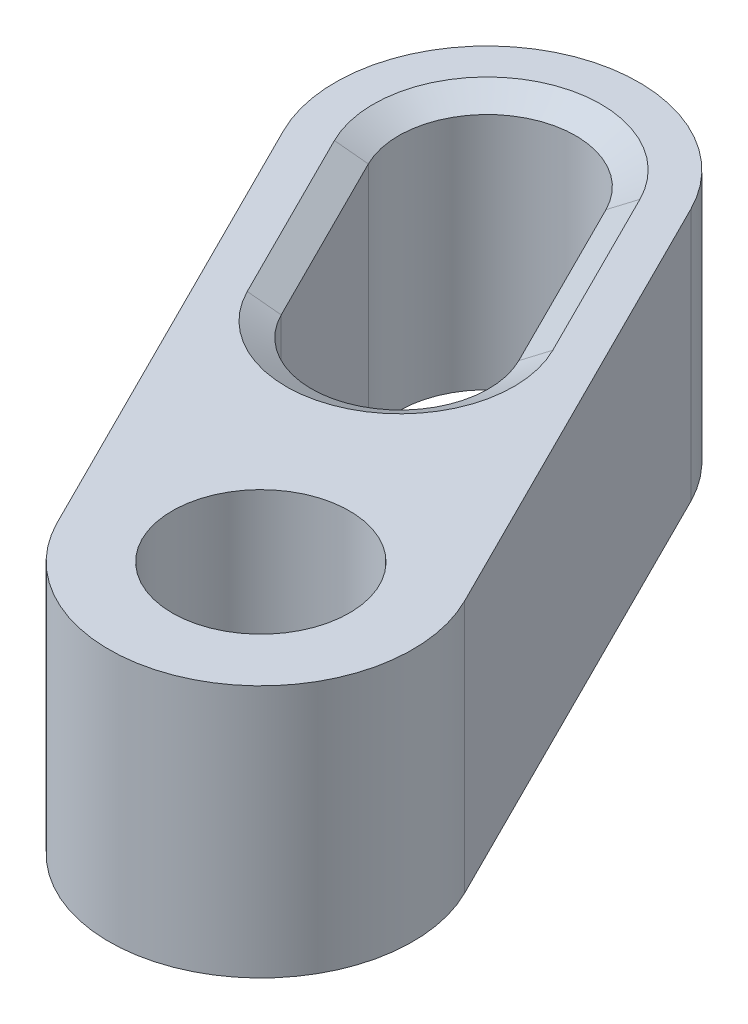
ISO-10303-21;
HEADER;
FILE_DESCRIPTION(('STEP AP214'),'2;1');
FILE_NAME('part.step','',(''),(''),'','','');
FILE_SCHEMA(('AUTOMOTIVE_DESIGN { 1 0 10303 214 1 1 1 1 }'));
ENDSEC;
DATA;
#1=APPLICATION_CONTEXT('core data for automotive mechanical design processes');
#2=APPLICATION_PROTOCOL_DEFINITION('international standard','automotive_design',2000,#1);
#3=PRODUCT_CONTEXT('',#1,'mechanical');
#4=PRODUCT('Part','Part','',(#3));
#5=PRODUCT_RELATED_PRODUCT_CATEGORY('part','',(#4));
#6=PRODUCT_DEFINITION_FORMATION('','',#4);
#7=PRODUCT_DEFINITION_CONTEXT('part definition',#1,'design');
#8=PRODUCT_DEFINITION('design','',#6,#7);
#9=PRODUCT_DEFINITION_SHAPE('','',#8);
#10=(LENGTH_UNIT() NAMED_UNIT(*) SI_UNIT(.MILLI.,.METRE.));
#11=(NAMED_UNIT(*) PLANE_ANGLE_UNIT() SI_UNIT($,.RADIAN.));
#12=(NAMED_UNIT(*) SI_UNIT($,.STERADIAN.) SOLID_ANGLE_UNIT());
#13=UNCERTAINTY_MEASURE_WITH_UNIT(LENGTH_MEASURE(1.E-05),#10,'distance_accuracy_value','');
#14=(GEOMETRIC_REPRESENTATION_CONTEXT(3) GLOBAL_UNCERTAINTY_ASSIGNED_CONTEXT((#13)) GLOBAL_UNIT_ASSIGNED_CONTEXT((#10,
#11,#12)) REPRESENTATION_CONTEXT('',''));
#15=CARTESIAN_POINT('',(0.,0.,0.));
#16=DIRECTION('',(0.,0.,1.));
#17=DIRECTION('',(1.,0.,0.));
#18=AXIS2_PLACEMENT_3D('',#15,#16,#17);
#19=CARTESIAN_POINT('',(12.75,5.,-34.2));
#20=DIRECTION('',(0.,1.,0.));
#21=DIRECTION('',(0.,0.,1.));
#22=AXIS2_PLACEMENT_3D('',#19,#20,#21);
#23=PLANE('',#22);
#24=DIRECTION('',(0.447213595499959,0.,0.894427190999916));
#25=VECTOR('',#24,1.);
#26=CARTESIAN_POINT('',(14.7624611797498,5.,-35.2062305898749));
#27=LINE('',#26,#25);
#28=CARTESIAN_POINT('',(10.2903252247502,5.,-44.1505024998741));
#29=VERTEX_POINT('',#28);
#30=CARTESIAN_POINT('',(12.0124611797498,5.,-40.7062305898749));
#31=VERTEX_POINT('',#30);
#32=EDGE_CURVE('E183',#29,#31,#27,.T.);
#33=ORIENTED_EDGE('',*,*,#32,.T.);
#34=CARTESIAN_POINT('',(10.,5.,-39.7));
#35=DIRECTION('',(0.,1.,0.));
#36=DIRECTION('',(0.,0.,1.));
#37=AXIS2_PLACEMENT_3D('',#34,#35,#36);
#38=CIRCLE('',#37,2.25000000000001);
#39=CARTESIAN_POINT('',(7.98753882025018,5.,-38.6937694101251));
#40=VERTEX_POINT('',#39);
#41=EDGE_CURVE('E185',#31,#40,#38,.F.);
#42=ORIENTED_EDGE('',*,*,#41,.T.);
#43=DIRECTION('',(-0.447213595499958,0.,-0.894427190999916));
#44=VECTOR('',#43,1.);
#45=CARTESIAN_POINT('',(10.7375388202502,5.,-33.1937694101251));
#46=LINE('',#45,#44);
#47=CARTESIAN_POINT('',(6.2654028652506,5.,-42.1380413201242));
#48=VERTEX_POINT('',#47);
#49=EDGE_CURVE('E181',#40,#48,#46,.T.);
#50=ORIENTED_EDGE('',*,*,#49,.T.);
#51=CARTESIAN_POINT('',(8.27786404500042,5.,-43.1442719099992));
#52=DIRECTION('',(0.,1.,0.));
#53=DIRECTION('',(0.,0.,1.));
#54=AXIS2_PLACEMENT_3D('',#51,#52,#53);
#55=CIRCLE('',#54,2.25000000000001);
#56=EDGE_CURVE('E179',#48,#29,#55,.F.);
#57=ORIENTED_EDGE('',*,*,#56,.T.);
#58=EDGE_LOOP('',(#33,#42,#50,#57));
#59=FACE_BOUND('',#58,.T.);
#60=CARTESIAN_POINT('',(12.75,5.,-34.2));
#61=DIRECTION('',(0.,1.,0.));
#62=DIRECTION('',(0.,0.,1.));
#63=AXIS2_PLACEMENT_3D('',#60,#61,#62);
#64=CIRCLE('',#63,3.);
#65=CARTESIAN_POINT('',(10.0667184270003,5.,-32.8583592135001));
#66=VERTEX_POINT('',#65);
#67=CARTESIAN_POINT('',(15.4332815729997,5.,-35.5416407864999));
#68=VERTEX_POINT('',#67);
#69=EDGE_CURVE('E149',#66,#68,#64,.T.);
#70=ORIENTED_EDGE('',*,*,#69,.T.);
#71=DIRECTION('',(-0.447213595499959,0.,-0.894427190999916));
#72=VECTOR('',#71,1.);
#73=CARTESIAN_POINT('',(15.4332815729997,5.,-35.5416407864999));
#74=LINE('',#73,#72);
#75=CARTESIAN_POINT('',(10.9611456180002,5.,-44.485912696499));
#76=VERTEX_POINT('',#75);
#77=EDGE_CURVE('E152',#68,#76,#74,.T.);
#78=ORIENTED_EDGE('',*,*,#77,.T.);
#79=CARTESIAN_POINT('',(8.27786404500042,5.,-43.1442719099992));
#80=DIRECTION('',(0.,1.,0.));
#81=DIRECTION('',(0.,0.,1.));
#82=AXIS2_PLACEMENT_3D('',#79,#80,#81);
#83=CIRCLE('',#82,3.);
#84=CARTESIAN_POINT('',(5.59458247200067,5.,-41.8026311234993));
#85=VERTEX_POINT('',#84);
#86=EDGE_CURVE('E155',#76,#85,#83,.T.);
#87=ORIENTED_EDGE('',*,*,#86,.T.);
#88=DIRECTION('',(0.447213595499959,0.,0.894427190999916));
#89=VECTOR('',#88,1.);
#90=CARTESIAN_POINT('',(10.0667184270003,5.,-32.8583592135001));
#91=LINE('',#90,#89);
#92=EDGE_CURVE('E157',#85,#66,#91,.T.);
#93=ORIENTED_EDGE('',*,*,#92,.T.);
#94=EDGE_LOOP('',(#70,#78,#87,#93));
#95=FACE_BOUND('',#94,.T.);
#96=CARTESIAN_POINT('',(12.75,5.,-34.2));
#97=DIRECTION('',(0.,1.,0.));
#98=DIRECTION('',(0.,0.,1.));
#99=AXIS2_PLACEMENT_3D('',#96,#97,#98);
#100=CIRCLE('',#99,1.75);
#101=CARTESIAN_POINT('',(12.75,5.,-32.45));
#102=VERTEX_POINT('',#101);
#103=EDGE_CURVE('E135',#102,#102,#100,.T.);
#104=ORIENTED_EDGE('',*,*,#103,.F.);
#105=EDGE_LOOP('',(#104));
#106=FACE_BOUND('',#105,.T.);
#107=ADVANCED_FACE('F33',(#59,#95,#106),#23,.T.);
#108=CARTESIAN_POINT('',(12.75,0.,-34.2));
#109=DIRECTION('',(0.,1.,0.));
#110=DIRECTION('',(0.,0.,1.));
#111=AXIS2_PLACEMENT_3D('',#108,#109,#110);
#112=PLANE('',#111);
#113=CARTESIAN_POINT('',(10.,0.,-39.7));
#114=DIRECTION('',(0.,1.,0.));
#115=DIRECTION('',(0.,0.,1.));
#116=AXIS2_PLACEMENT_3D('',#113,#114,#115);
#117=CIRCLE('',#116,1.75);
#118=CARTESIAN_POINT('',(8.43475241575014,0.,-38.9173762078751));
#119=VERTEX_POINT('',#118);
#120=CARTESIAN_POINT('',(11.5652475842499,0.,-40.4826237921249));
#121=VERTEX_POINT('',#120);
#122=EDGE_CURVE('E116',#119,#121,#117,.T.);
#123=ORIENTED_EDGE('',*,*,#122,.T.);
#124=DIRECTION('',(-0.447213595499959,0.,-0.894427190999916));
#125=VECTOR('',#124,1.);
#126=CARTESIAN_POINT('',(11.5652475842499,0.,-40.4826237921249));
#127=LINE('',#126,#125);
#128=CARTESIAN_POINT('',(9.84311162925027,0.,-43.9268957021241));
#129=VERTEX_POINT('',#128);
#130=EDGE_CURVE('E124',#121,#129,#127,.T.);
#131=ORIENTED_EDGE('',*,*,#130,.T.);
#132=CARTESIAN_POINT('',(8.27786404500042,0.,-43.1442719099992));
#133=DIRECTION('',(0.,1.,0.));
#134=DIRECTION('',(0.,0.,1.));
#135=AXIS2_PLACEMENT_3D('',#132,#133,#134);
#136=CIRCLE('',#135,1.75);
#137=CARTESIAN_POINT('',(6.71261646075056,0.,-42.3616481178742));
#138=VERTEX_POINT('',#137);
#139=EDGE_CURVE('E129',#129,#138,#136,.T.);
#140=ORIENTED_EDGE('',*,*,#139,.T.);
#141=DIRECTION('',(0.447213595499958,0.,0.894427190999916));
#142=VECTOR('',#141,1.);
#143=CARTESIAN_POINT('',(8.43475241575015,0.,-38.9173762078751));
#144=LINE('',#143,#142);
#145=EDGE_CURVE('E134',#138,#119,#144,.T.);
#146=ORIENTED_EDGE('',*,*,#145,.T.);
#147=EDGE_LOOP('',(#123,#131,#140,#146));
#148=FACE_BOUND('',#147,.T.);
#149=CARTESIAN_POINT('',(12.75,0.,-34.2));
#150=DIRECTION('',(0.,1.,0.));
#151=DIRECTION('',(0.,0.,1.));
#152=AXIS2_PLACEMENT_3D('',#149,#150,#151);
#153=CIRCLE('',#152,3.);
#154=CARTESIAN_POINT('',(10.0667184270003,0.,-32.8583592135001));
#155=VERTEX_POINT('',#154);
#156=CARTESIAN_POINT('',(15.4332815729997,0.,-35.5416407864999));
#157=VERTEX_POINT('',#156);
#158=EDGE_CURVE('E120',#155,#157,#153,.T.);
#159=ORIENTED_EDGE('',*,*,#158,.F.);
#160=DIRECTION('',(0.447213595499959,0.,0.894427190999916));
#161=VECTOR('',#160,1.);
#162=CARTESIAN_POINT('',(10.0667184270003,0.,-32.8583592135001));
#163=LINE('',#162,#161);
#164=CARTESIAN_POINT('',(5.59458247200067,0.,-41.8026311234993));
#165=VERTEX_POINT('',#164);
#166=EDGE_CURVE('E153',#165,#155,#163,.T.);
#167=ORIENTED_EDGE('',*,*,#166,.F.);
#168=CARTESIAN_POINT('',(8.27786404500042,0.,-43.1442719099992));
#169=DIRECTION('',(0.,1.,0.));
#170=DIRECTION('',(0.,0.,1.));
#171=AXIS2_PLACEMENT_3D('',#168,#169,#170);
#172=CIRCLE('',#171,3.);
#173=CARTESIAN_POINT('',(10.9611456180002,0.,-44.485912696499));
#174=VERTEX_POINT('',#173);
#175=EDGE_CURVE('E164',#174,#165,#172,.T.);
#176=ORIENTED_EDGE('',*,*,#175,.F.);
#177=DIRECTION('',(-0.447213595499959,0.,-0.894427190999916));
#178=VECTOR('',#177,1.);
#179=CARTESIAN_POINT('',(15.4332815729997,0.,-35.5416407864999));
#180=LINE('',#179,#178);
#181=EDGE_CURVE('E162',#157,#174,#180,.T.);
#182=ORIENTED_EDGE('',*,*,#181,.F.);
#183=EDGE_LOOP('',(#159,#167,#176,#182));
#184=FACE_BOUND('',#183,.T.);
#185=CARTESIAN_POINT('',(12.75,0.,-34.2));
#186=DIRECTION('',(0.,1.,0.));
#187=DIRECTION('',(0.,0.,1.));
#188=AXIS2_PLACEMENT_3D('',#185,#186,#187);
#189=CIRCLE('',#188,1.75);
#190=CARTESIAN_POINT('',(12.75,0.,-32.45));
#191=VERTEX_POINT('',#190);
#192=EDGE_CURVE('E138',#191,#191,#189,.T.);
#193=ORIENTED_EDGE('',*,*,#192,.T.);
#194=EDGE_LOOP('',(#193));
#195=FACE_BOUND('',#194,.T.);
#196=ADVANCED_FACE('F131',(#148,#184,#195),#112,.F.);
#197=CARTESIAN_POINT('',(12.75,5.,-34.2));
#198=DIRECTION('',(0.,-1.,0.));
#199=DIRECTION('',(0.,0.,-1.));
#200=AXIS2_PLACEMENT_3D('',#197,#198,#199);
#201=CYLINDRICAL_SURFACE('',#200,3.);
#202=ORIENTED_EDGE('',*,*,#158,.T.);
#203=DIRECTION('',(0.,-1.,0.));
#204=VECTOR('',#203,1.);
#205=CARTESIAN_POINT('',(15.4332815729997,5.,-35.5416407864999));
#206=LINE('',#205,#204);
#207=EDGE_CURVE('E175',#68,#157,#206,.T.);
#208=ORIENTED_EDGE('',*,*,#207,.F.);
#209=ORIENTED_EDGE('',*,*,#69,.F.);
#210=DIRECTION('',(0.,-1.,0.));
#211=VECTOR('',#210,1.);
#212=CARTESIAN_POINT('',(10.0667184270003,5.,-32.8583592135001));
#213=LINE('',#212,#211);
#214=EDGE_CURVE('E159',#66,#155,#213,.T.);
#215=ORIENTED_EDGE('',*,*,#214,.T.);
#216=EDGE_LOOP('',(#202,#208,#209,#215));
#217=FACE_BOUND('',#216,.T.);
#218=ADVANCED_FACE('F227',(#217),#201,.T.);
#219=CARTESIAN_POINT('',(15.4332815729997,5.,-35.5416407864999));
#220=DIRECTION('',(-0.894427190999916,0.,0.447213595499959));
#221=DIRECTION('',(0.447213595499959,0.,0.894427190999916));
#222=AXIS2_PLACEMENT_3D('',#219,#220,#221);
#223=PLANE('',#222);
#224=ORIENTED_EDGE('',*,*,#181,.T.);
#225=DIRECTION('',(0.,-1.,0.));
#226=VECTOR('',#225,1.);
#227=CARTESIAN_POINT('',(10.9611456180002,5.,-44.485912696499));
#228=LINE('',#227,#226);
#229=EDGE_CURVE('E172',#76,#174,#228,.T.);
#230=ORIENTED_EDGE('',*,*,#229,.F.);
#231=ORIENTED_EDGE('',*,*,#77,.F.);
#232=ORIENTED_EDGE('',*,*,#207,.T.);
#233=EDGE_LOOP('',(#224,#230,#231,#232));
#234=FACE_BOUND('',#233,.T.);
#235=ADVANCED_FACE('F240',(#234),#223,.F.);
#236=CARTESIAN_POINT('',(8.27786404500042,5.,-43.1442719099992));
#237=DIRECTION('',(0.,-1.,0.));
#238=DIRECTION('',(0.,0.,-1.));
#239=AXIS2_PLACEMENT_3D('',#236,#237,#238);
#240=CYLINDRICAL_SURFACE('',#239,3.);
#241=ORIENTED_EDGE('',*,*,#175,.T.);
#242=DIRECTION('',(0.,-1.,0.));
#243=VECTOR('',#242,1.);
#244=CARTESIAN_POINT('',(5.59458247200067,5.,-41.8026311234993));
#245=LINE('',#244,#243);
#246=EDGE_CURVE('E169',#85,#165,#245,.T.);
#247=ORIENTED_EDGE('',*,*,#246,.F.);
#248=ORIENTED_EDGE('',*,*,#86,.F.);
#249=ORIENTED_EDGE('',*,*,#229,.T.);
#250=EDGE_LOOP('',(#241,#247,#248,#249));
#251=FACE_BOUND('',#250,.T.);
#252=ADVANCED_FACE('F236',(#251),#240,.T.);
#253=CARTESIAN_POINT('',(10.0667184270003,5.,-32.8583592135001));
#254=DIRECTION('',(0.894427190999916,0.,-0.447213595499959));
#255=DIRECTION('',(-0.447213595499959,0.,-0.894427190999915));
#256=AXIS2_PLACEMENT_3D('',#253,#254,#255);
#257=PLANE('',#256);
#258=ORIENTED_EDGE('',*,*,#166,.T.);
#259=ORIENTED_EDGE('',*,*,#214,.F.);
#260=ORIENTED_EDGE('',*,*,#92,.F.);
#261=ORIENTED_EDGE('',*,*,#246,.T.);
#262=EDGE_LOOP('',(#258,#259,#260,#261));
#263=FACE_BOUND('',#262,.T.);
#264=ADVANCED_FACE('F233',(#263),#257,.F.);
#265=CARTESIAN_POINT('',(10.,5.,-39.7));
#266=DIRECTION('',(0.,-1.,0.));
#267=DIRECTION('',(0.,0.,-1.));
#268=AXIS2_PLACEMENT_3D('',#265,#266,#267);
#269=CYLINDRICAL_SURFACE('',#268,1.75);
#270=DIRECTION('',(0.,-1.,0.));
#271=VECTOR('',#270,1.);
#272=CARTESIAN_POINT('',(8.43475241575015,5.,-38.9173762078751));
#273=LINE('',#272,#271);
#274=CARTESIAN_POINT('',(8.43475241575015,4.71132486540518,-38.9173762078751));
#275=VERTEX_POINT('',#274);
#276=EDGE_CURVE('E144',#275,#119,#273,.T.);
#277=ORIENTED_EDGE('',*,*,#276,.F.);
#278=CARTESIAN_POINT('',(10.,4.71132486540518,-39.7));
#279=DIRECTION('',(0.,1.,0.));
#280=DIRECTION('',(0.,0.,1.));
#281=AXIS2_PLACEMENT_3D('',#278,#279,#280);
#282=CIRCLE('',#281,1.75);
#283=CARTESIAN_POINT('',(11.5652475842499,4.71132486540518,-40.4826237921249));
#284=VERTEX_POINT('',#283);
#285=EDGE_CURVE('E119',#275,#284,#282,.T.);
#286=ORIENTED_EDGE('',*,*,#285,.T.);
#287=DIRECTION('',(0.,-1.,0.));
#288=VECTOR('',#287,1.);
#289=CARTESIAN_POINT('',(11.5652475842499,5.,-40.4826237921249));
#290=LINE('',#289,#288);
#291=EDGE_CURVE('E111',#284,#121,#290,.T.);
#292=ORIENTED_EDGE('',*,*,#291,.T.);
#293=ORIENTED_EDGE('',*,*,#122,.F.);
#294=EDGE_LOOP('',(#277,#286,#292,#293));
#295=FACE_BOUND('',#294,.T.);
#296=ADVANCED_FACE('F114',(#295),#269,.F.);
#297=CARTESIAN_POINT('',(11.5652475842499,5.,-40.4826237921249));
#298=DIRECTION('',(-0.894427190999916,0.,0.447213595499959));
#299=DIRECTION('',(0.447213595499959,0.,0.894427190999916));
#300=AXIS2_PLACEMENT_3D('',#297,#298,#299);
#301=PLANE('',#300);
#302=ORIENTED_EDGE('',*,*,#291,.F.);
#303=DIRECTION('',(-0.447213595499959,0.,-0.894427190999916));
#304=VECTOR('',#303,1.);
#305=CARTESIAN_POINT('',(11.5652475842499,4.71132486540518,-40.4826237921249));
#306=LINE('',#305,#304);
#307=CARTESIAN_POINT('',(9.84311162925027,4.71132486540518,-43.9268957021241));
#308=VERTEX_POINT('',#307);
#309=EDGE_CURVE('E56',#284,#308,#306,.T.);
#310=ORIENTED_EDGE('',*,*,#309,.T.);
#311=DIRECTION('',(0.,-1.,0.));
#312=VECTOR('',#311,1.);
#313=CARTESIAN_POINT('',(9.84311162925027,5.,-43.9268957021241));
#314=LINE('',#313,#312);
#315=EDGE_CURVE('E121',#308,#129,#314,.T.);
#316=ORIENTED_EDGE('',*,*,#315,.T.);
#317=ORIENTED_EDGE('',*,*,#130,.F.);
#318=EDGE_LOOP('',(#302,#310,#316,#317));
#319=FACE_BOUND('',#318,.T.);
#320=ADVANCED_FACE('F125',(#319),#301,.T.);
#321=CARTESIAN_POINT('',(8.27786404500042,5.,-43.1442719099992));
#322=DIRECTION('',(0.,-1.,0.));
#323=DIRECTION('',(0.,0.,-1.));
#324=AXIS2_PLACEMENT_3D('',#321,#322,#323);
#325=CYLINDRICAL_SURFACE('',#324,1.75);
#326=ORIENTED_EDGE('',*,*,#315,.F.);
#327=CARTESIAN_POINT('',(8.27786404500042,4.71132486540518,-43.1442719099992));
#328=DIRECTION('',(0.,1.,0.));
#329=DIRECTION('',(0.,0.,1.));
#330=AXIS2_PLACEMENT_3D('',#327,#328,#329);
#331=CIRCLE('',#330,1.75);
#332=CARTESIAN_POINT('',(6.71261646075056,4.71132486540518,-42.3616481178742));
#333=VERTEX_POINT('',#332);
#334=EDGE_CURVE('E11',#308,#333,#331,.T.);
#335=ORIENTED_EDGE('',*,*,#334,.T.);
#336=DIRECTION('',(0.,-1.,0.));
#337=VECTOR('',#336,1.);
#338=CARTESIAN_POINT('',(6.71261646075056,5.,-42.3616481178742));
#339=LINE('',#338,#337);
#340=EDGE_CURVE('E146',#333,#138,#339,.T.);
#341=ORIENTED_EDGE('',*,*,#340,.T.);
#342=ORIENTED_EDGE('',*,*,#139,.F.);
#343=EDGE_LOOP('',(#326,#335,#341,#342));
#344=FACE_BOUND('',#343,.T.);
#345=ADVANCED_FACE('F218',(#344),#325,.F.);
#346=CARTESIAN_POINT('',(8.43475241575015,5.,-38.9173762078751));
#347=DIRECTION('',(0.894427190999916,0.,-0.447213595499958));
#348=DIRECTION('',(-0.447213595499958,0.,-0.894427190999916));
#349=AXIS2_PLACEMENT_3D('',#346,#347,#348);
#350=PLANE('',#349);
#351=ORIENTED_EDGE('',*,*,#340,.F.);
#352=DIRECTION('',(0.447213595499958,0.,0.894427190999916));
#353=VECTOR('',#352,1.);
#354=CARTESIAN_POINT('',(8.43475241575015,4.71132486540518,-38.9173762078751));
#355=LINE('',#354,#353);
#356=EDGE_CURVE('E42',#333,#275,#355,.T.);
#357=ORIENTED_EDGE('',*,*,#356,.T.);
#358=ORIENTED_EDGE('',*,*,#276,.T.);
#359=ORIENTED_EDGE('',*,*,#145,.F.);
#360=EDGE_LOOP('',(#351,#357,#358,#359));
#361=FACE_BOUND('',#360,.T.);
#362=ADVANCED_FACE('F209',(#361),#350,.T.);
#363=CARTESIAN_POINT('',(12.75,5.,-34.2));
#364=DIRECTION('',(0.,-1.,0.));
#365=DIRECTION('',(0.,0.,-1.));
#366=AXIS2_PLACEMENT_3D('',#363,#364,#365);
#367=CYLINDRICAL_SURFACE('',#366,1.75);
#368=ORIENTED_EDGE('',*,*,#103,.T.);
#369=EDGE_LOOP('',(#368));
#370=FACE_BOUND('',#369,.T.);
#371=ORIENTED_EDGE('',*,*,#192,.F.);
#372=EDGE_LOOP('',(#371));
#373=FACE_BOUND('',#372,.T.);
#374=ADVANCED_FACE('F207',(#370,#373),#367,.F.);
#375=CARTESIAN_POINT('',(8.27786404500042,4.71132486540518,-43.1442719099992));
#376=DIRECTION('',(0.,1.,0.));
#377=DIRECTION('',(0.,0.,1.));
#378=AXIS2_PLACEMENT_3D('',#375,#376,#377);
#379=CONICAL_SURFACE('',#378,1.75,1.0471975511966);
#380=DIRECTION('',(-0.774596669241485,-0.499999999999996,0.387298334620744));
#381=VECTOR('',#380,1.);
#382=CARTESIAN_POINT('',(10.2903252247502,5.,-44.1505024998741));
#383=LINE('',#382,#381);
#384=EDGE_CURVE('E193',#29,#308,#383,.T.);
#385=ORIENTED_EDGE('',*,*,#384,.F.);
#386=ORIENTED_EDGE('',*,*,#56,.F.);
#387=DIRECTION('',(-0.774596669241485,0.499999999999996,0.387298334620744));
#388=VECTOR('',#387,1.);
#389=CARTESIAN_POINT('',(6.71261646075056,4.71132486540518,-42.3616481178742));
#390=LINE('',#389,#388);
#391=EDGE_CURVE('E37',#333,#48,#390,.T.);
#392=ORIENTED_EDGE('',*,*,#391,.F.);
#393=ORIENTED_EDGE('',*,*,#334,.F.);
#394=EDGE_LOOP('',(#385,#386,#392,#393));
#395=FACE_BOUND('',#394,.T.);
#396=ADVANCED_FACE('F35',(#395),#379,.F.);
#397=CARTESIAN_POINT('',(8.43475241575015,4.71132486540518,-38.9173762078751));
#398=DIRECTION('',(-0.447213595499955,-0.86602540378444,0.223606797749978));
#399=DIRECTION('',(0.447213595499958,0.,0.894427190999916));
#400=AXIS2_PLACEMENT_3D('',#397,#398,#399);
#401=PLANE('',#400);
#402=ORIENTED_EDGE('',*,*,#391,.T.);
#403=ORIENTED_EDGE('',*,*,#49,.F.);
#404=DIRECTION('',(-0.774596669241485,0.499999999999996,0.387298334620744));
#405=VECTOR('',#404,1.);
#406=CARTESIAN_POINT('',(8.43475241575015,4.71132486540518,-38.9173762078751));
#407=LINE('',#406,#405);
#408=EDGE_CURVE('E192',#275,#40,#407,.T.);
#409=ORIENTED_EDGE('',*,*,#408,.F.);
#410=ORIENTED_EDGE('',*,*,#356,.F.);
#411=EDGE_LOOP('',(#402,#403,#409,#410));
#412=FACE_BOUND('',#411,.T.);
#413=ADVANCED_FACE('F216',(#412),#401,.F.);
#414=CARTESIAN_POINT('',(11.5652475842499,4.71132486540518,-40.4826237921249));
#415=DIRECTION('',(0.447213595499952,-0.866025403784442,-0.223606797749977));
#416=DIRECTION('',(-0.447213595499959,0.,-0.894427190999916));
#417=AXIS2_PLACEMENT_3D('',#414,#415,#416);
#418=PLANE('',#417);
#419=ORIENTED_EDGE('',*,*,#384,.T.);
#420=ORIENTED_EDGE('',*,*,#309,.F.);
#421=DIRECTION('',(-0.774596669241487,-0.499999999999994,0.387298334620742));
#422=VECTOR('',#421,1.);
#423=CARTESIAN_POINT('',(12.0124611797498,5.,-40.7062305898749));
#424=LINE('',#423,#422);
#425=EDGE_CURVE('E190',#31,#284,#424,.T.);
#426=ORIENTED_EDGE('',*,*,#425,.F.);
#427=ORIENTED_EDGE('',*,*,#32,.F.);
#428=EDGE_LOOP('',(#419,#420,#426,#427));
#429=FACE_BOUND('',#428,.T.);
#430=ADVANCED_FACE('F251',(#429),#418,.F.);
#431=CARTESIAN_POINT('',(10.,4.71132486540518,-39.7));
#432=DIRECTION('',(0.,1.,0.));
#433=DIRECTION('',(0.,0.,1.));
#434=AXIS2_PLACEMENT_3D('',#431,#432,#433);
#435=CONICAL_SURFACE('',#434,1.75,1.0471975511966);
#436=ORIENTED_EDGE('',*,*,#408,.T.);
#437=ORIENTED_EDGE('',*,*,#41,.F.);
#438=ORIENTED_EDGE('',*,*,#425,.T.);
#439=ORIENTED_EDGE('',*,*,#285,.F.);
#440=EDGE_LOOP('',(#436,#437,#438,#439));
#441=FACE_BOUND('',#440,.T.);
#442=ADVANCED_FACE('F248',(#441),#435,.F.);
#443=CLOSED_SHELL('',(#107,#196,#218,#235,#252,#264,#296,#320,#345,#362,#374,#396,#413,#430,#442));
#444=MANIFOLD_SOLID_BREP('B2',#443);
#445=ADVANCED_BREP_SHAPE_REPRESENTATION('',(#18,#444),#14);
#446=SHAPE_DEFINITION_REPRESENTATION(#9,#445);
ENDSEC;
END-ISO-10303-21;
